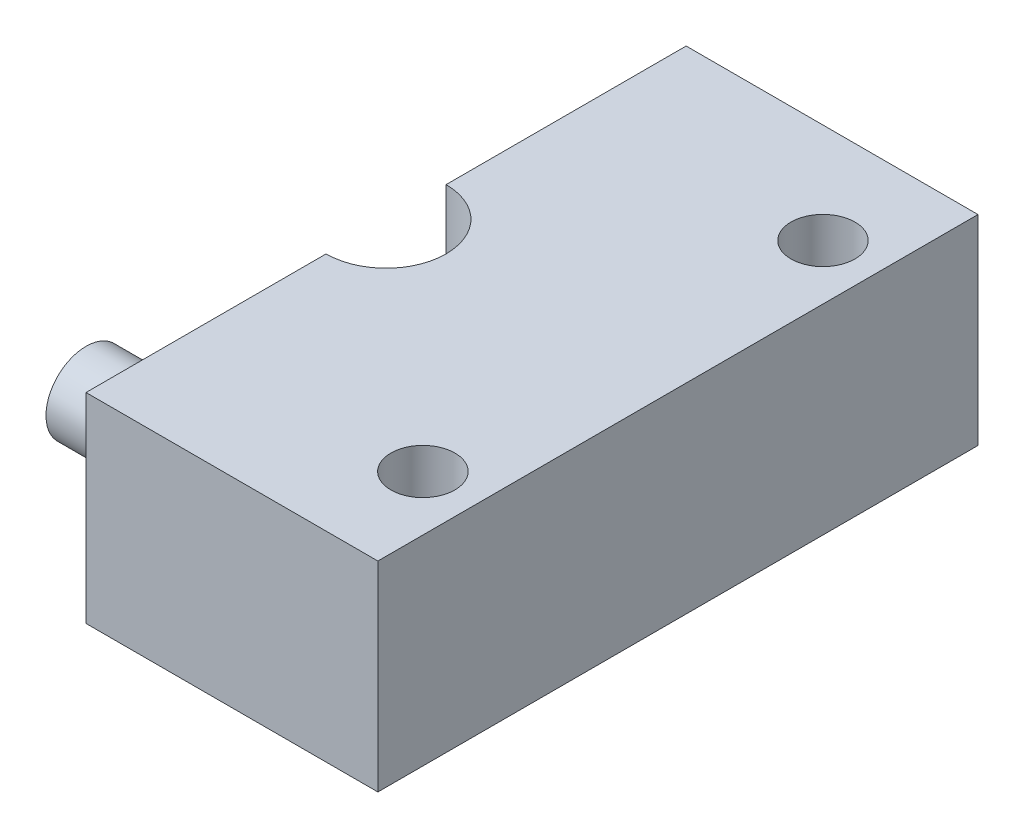
ISO-10303-21;
HEADER;
FILE_DESCRIPTION(('STEP AP214'),'2;1');
FILE_NAME('part.step','',(''),(''),'','','');
FILE_SCHEMA(('AUTOMOTIVE_DESIGN { 1 0 10303 214 1 1 1 1 }'));
ENDSEC;
DATA;
#1=APPLICATION_CONTEXT('core data for automotive mechanical design processes');
#2=APPLICATION_PROTOCOL_DEFINITION('international standard','automotive_design',2000,#1);
#3=PRODUCT_CONTEXT('',#1,'mechanical');
#4=PRODUCT('Part','Part','',(#3));
#5=PRODUCT_RELATED_PRODUCT_CATEGORY('part','',(#4));
#6=PRODUCT_DEFINITION_FORMATION('','',#4);
#7=PRODUCT_DEFINITION_CONTEXT('part definition',#1,'design');
#8=PRODUCT_DEFINITION('design','',#6,#7);
#9=PRODUCT_DEFINITION_SHAPE('','',#8);
#10=(LENGTH_UNIT() NAMED_UNIT(*) SI_UNIT(.MILLI.,.METRE.));
#11=(NAMED_UNIT(*) PLANE_ANGLE_UNIT() SI_UNIT($,.RADIAN.));
#12=(NAMED_UNIT(*) SI_UNIT($,.STERADIAN.) SOLID_ANGLE_UNIT());
#13=UNCERTAINTY_MEASURE_WITH_UNIT(LENGTH_MEASURE(1.E-05),#10,'distance_accuracy_value','');
#14=(GEOMETRIC_REPRESENTATION_CONTEXT(3) GLOBAL_UNCERTAINTY_ASSIGNED_CONTEXT((#13)) GLOBAL_UNIT_ASSIGNED_CONTEXT((#10,
#11,#12)) REPRESENTATION_CONTEXT('',''));
#15=CARTESIAN_POINT('',(0.,0.,0.));
#16=DIRECTION('',(0.,0.,1.));
#17=DIRECTION('',(1.,0.,0.));
#18=AXIS2_PLACEMENT_3D('',#15,#16,#17);
#19=CARTESIAN_POINT('',(0.,10.,30.));
#20=DIRECTION('',(1.,0.,0.));
#21=DIRECTION('',(0.,0.,-1.));
#22=AXIS2_PLACEMENT_3D('',#19,#20,#21);
#23=PLANE('',#22);
#24=CARTESIAN_POINT('',(0.,5.,25.));
#25=DIRECTION('',(1.,0.,0.));
#26=DIRECTION('',(0.,0.,-1.));
#27=AXIS2_PLACEMENT_3D('',#24,#25,#26);
#28=CIRCLE('',#27,3.);
#29=CARTESIAN_POINT('',(0.,5.,22.));
#30=VERTEX_POINT('',#29);
#31=EDGE_CURVE('E195',#30,#30,#28,.T.);
#32=ORIENTED_EDGE('',*,*,#31,.T.);
#33=EDGE_LOOP('',(#32));
#34=FACE_BOUND('',#33,.T.);
#35=DIRECTION('',(0.,0.,-1.));
#36=VECTOR('',#35,1.);
#37=CARTESIAN_POINT('',(0.,10.,30.));
#38=LINE('',#37,#36);
#39=CARTESIAN_POINT('',(0.,10.,30.));
#40=VERTEX_POINT('',#39);
#41=CARTESIAN_POINT('',(0.,10.,18.));
#42=VERTEX_POINT('',#41);
#43=EDGE_CURVE('E127',#40,#42,#38,.T.);
#44=ORIENTED_EDGE('',*,*,#43,.T.);
#45=DIRECTION('',(0.,1.,0.));
#46=VECTOR('',#45,1.);
#47=CARTESIAN_POINT('',(0.,-3.70820393249937,18.));
#48=LINE('',#47,#46);
#49=CARTESIAN_POINT('',(0.,3.,18.));
#50=VERTEX_POINT('',#49);
#51=EDGE_CURVE('E114',#50,#42,#48,.T.);
#52=ORIENTED_EDGE('',*,*,#51,.F.);
#53=DIRECTION('',(0.,0.,-1.));
#54=VECTOR('',#53,1.);
#55=CARTESIAN_POINT('',(0.,3.,21.));
#56=LINE('',#55,#54);
#57=CARTESIAN_POINT('',(0.,3.,21.));
#58=VERTEX_POINT('',#57);
#59=EDGE_CURVE('E124',#58,#50,#56,.T.);
#60=ORIENTED_EDGE('',*,*,#59,.F.);
#61=DIRECTION('',(0.,-1.,0.));
#62=VECTOR('',#61,1.);
#63=CARTESIAN_POINT('',(0.,3.,21.));
#64=LINE('',#63,#62);
#65=CARTESIAN_POINT('',(0.,0.,21.));
#66=VERTEX_POINT('',#65);
#67=EDGE_CURVE('E154',#58,#66,#64,.T.);
#68=ORIENTED_EDGE('',*,*,#67,.T.);
#69=DIRECTION('',(0.,0.,-1.));
#70=VECTOR('',#69,1.);
#71=CARTESIAN_POINT('',(0.,0.,30.));
#72=LINE('',#71,#70);
#73=CARTESIAN_POINT('',(0.,0.,30.));
#74=VERTEX_POINT('',#73);
#75=EDGE_CURVE('E189',#74,#66,#72,.T.);
#76=ORIENTED_EDGE('',*,*,#75,.F.);
#77=DIRECTION('',(0.,-1.,0.));
#78=VECTOR('',#77,1.);
#79=CARTESIAN_POINT('',(0.,10.,30.));
#80=LINE('',#79,#78);
#81=EDGE_CURVE('E162',#40,#74,#80,.T.);
#82=ORIENTED_EDGE('',*,*,#81,.F.);
#83=EDGE_LOOP('',(#44,#52,#60,#68,#76,#82));
#84=FACE_BOUND('',#83,.T.);
#85=ADVANCED_FACE('F35',(#34,#84),#23,.F.);
#86=CARTESIAN_POINT('',(0.,5.,5.));
#87=DIRECTION('',(1.,0.,0.));
#88=DIRECTION('',(0.,0.,-1.));
#89=AXIS2_PLACEMENT_3D('',#86,#87,#88);
#90=CIRCLE('',#89,3.075);
#91=CARTESIAN_POINT('',(0.,5.,1.925));
#92=VERTEX_POINT('',#91);
#93=EDGE_CURVE('E11',#92,#92,#90,.T.);
#94=ORIENTED_EDGE('',*,*,#93,.T.);
#95=EDGE_LOOP('',(#94));
#96=FACE_BOUND('',#95,.T.);
#97=CARTESIAN_POINT('',(0.,3.,12.));
#98=VERTEX_POINT('',#97);
#99=CARTESIAN_POINT('',(0.,3.,9.));
#100=VERTEX_POINT('',#99);
#101=EDGE_CURVE('E136',#98,#100,#56,.T.);
#102=ORIENTED_EDGE('',*,*,#101,.F.);
#103=DIRECTION('',(0.,1.,0.));
#104=VECTOR('',#103,1.);
#105=CARTESIAN_POINT('',(0.,-3.70820393249937,12.));
#106=LINE('',#105,#104);
#107=CARTESIAN_POINT('',(0.,10.,12.));
#108=VERTEX_POINT('',#107);
#109=EDGE_CURVE('E50',#98,#108,#106,.T.);
#110=ORIENTED_EDGE('',*,*,#109,.T.);
#111=CARTESIAN_POINT('',(0.,10.,0.));
#112=VERTEX_POINT('',#111);
#113=EDGE_CURVE('E172',#108,#112,#38,.T.);
#114=ORIENTED_EDGE('',*,*,#113,.T.);
#115=DIRECTION('',(0.,-1.,0.));
#116=VECTOR('',#115,1.);
#117=CARTESIAN_POINT('',(0.,10.,0.));
#118=LINE('',#117,#116);
#119=CARTESIAN_POINT('',(0.,0.,0.));
#120=VERTEX_POINT('',#119);
#121=EDGE_CURVE('E156',#112,#120,#118,.T.);
#122=ORIENTED_EDGE('',*,*,#121,.T.);
#123=CARTESIAN_POINT('',(0.,0.,9.));
#124=VERTEX_POINT('',#123);
#125=EDGE_CURVE('E188',#124,#120,#72,.T.);
#126=ORIENTED_EDGE('',*,*,#125,.F.);
#127=DIRECTION('',(0.,-1.,0.));
#128=VECTOR('',#127,1.);
#129=CARTESIAN_POINT('',(0.,3.,9.));
#130=LINE('',#129,#128);
#131=EDGE_CURVE('E58',#100,#124,#130,.T.);
#132=ORIENTED_EDGE('',*,*,#131,.F.);
#133=EDGE_LOOP('',(#102,#110,#114,#122,#126,#132));
#134=FACE_BOUND('',#133,.T.);
#135=ADVANCED_FACE('F213',(#96,#134),#23,.F.);
#136=CARTESIAN_POINT('',(0.,0.,30.));
#137=DIRECTION('',(0.,1.,0.));
#138=DIRECTION('',(0.,0.,1.));
#139=AXIS2_PLACEMENT_3D('',#136,#137,#138);
#140=PLANE('',#139);
#141=CARTESIAN_POINT('',(11.84,0.,25.));
#142=DIRECTION('',(0.,1.,0.));
#143=DIRECTION('',(0.,0.,1.));
#144=AXIS2_PLACEMENT_3D('',#141,#142,#143);
#145=CIRCLE('',#144,1.6);
#146=CARTESIAN_POINT('',(11.84,0.,26.6));
#147=VERTEX_POINT('',#146);
#148=EDGE_CURVE('E255',#147,#147,#145,.F.);
#149=ORIENTED_EDGE('',*,*,#148,.F.);
#150=EDGE_LOOP('',(#149));
#151=FACE_BOUND('',#150,.T.);
#152=CARTESIAN_POINT('',(11.84,0.,5.));
#153=DIRECTION('',(0.,1.,0.));
#154=DIRECTION('',(0.,0.,1.));
#155=AXIS2_PLACEMENT_3D('',#152,#153,#154);
#156=CIRCLE('',#155,1.6);
#157=CARTESIAN_POINT('',(11.84,0.,6.6));
#158=VERTEX_POINT('',#157);
#159=EDGE_CURVE('E143',#158,#158,#156,.F.);
#160=ORIENTED_EDGE('',*,*,#159,.F.);
#161=EDGE_LOOP('',(#160));
#162=FACE_BOUND('',#161,.T.);
#163=ORIENTED_EDGE('',*,*,#75,.T.);
#164=DIRECTION('',(-1.,0.,0.));
#165=VECTOR('',#164,1.);
#166=CARTESIAN_POINT('',(0.,0.,21.));
#167=LINE('',#166,#165);
#168=CARTESIAN_POINT('',(3.50749198145912,0.,21.));
#169=VERTEX_POINT('',#168);
#170=EDGE_CURVE('E141',#169,#66,#167,.T.);
#171=ORIENTED_EDGE('',*,*,#170,.F.);
#172=CARTESIAN_POINT('',(0.,0.,15.));
#173=DIRECTION('',(0.,-1.,0.));
#174=DIRECTION('',(0.,0.,-1.));
#175=AXIS2_PLACEMENT_3D('',#172,#173,#174);
#176=CIRCLE('',#175,6.95);
#177=CARTESIAN_POINT('',(3.50749198145913,0.,9.));
#178=VERTEX_POINT('',#177);
#179=EDGE_CURVE('E150',#178,#169,#176,.T.);
#180=ORIENTED_EDGE('',*,*,#179,.F.);
#181=DIRECTION('',(1.,0.,0.));
#182=VECTOR('',#181,1.);
#183=CARTESIAN_POINT('',(0.,0.,9.));
#184=LINE('',#183,#182);
#185=EDGE_CURVE('E148',#124,#178,#184,.T.);
#186=ORIENTED_EDGE('',*,*,#185,.F.);
#187=ORIENTED_EDGE('',*,*,#125,.T.);
#188=DIRECTION('',(1.,0.,0.));
#189=VECTOR('',#188,1.);
#190=CARTESIAN_POINT('',(0.,0.,0.));
#191=LINE('',#190,#189);
#192=CARTESIAN_POINT('',(14.59,0.,0.));
#193=VERTEX_POINT('',#192);
#194=EDGE_CURVE('E175',#120,#193,#191,.T.);
#195=ORIENTED_EDGE('',*,*,#194,.T.);
#196=DIRECTION('',(0.,0.,-1.));
#197=VECTOR('',#196,1.);
#198=CARTESIAN_POINT('',(14.59,0.,30.));
#199=LINE('',#198,#197);
#200=CARTESIAN_POINT('',(14.59,0.,30.));
#201=VERTEX_POINT('',#200);
#202=EDGE_CURVE('E185',#201,#193,#199,.T.);
#203=ORIENTED_EDGE('',*,*,#202,.F.);
#204=DIRECTION('',(1.,0.,0.));
#205=VECTOR('',#204,1.);
#206=CARTESIAN_POINT('',(0.,0.,30.));
#207=LINE('',#206,#205);
#208=EDGE_CURVE('E165',#74,#201,#207,.T.);
#209=ORIENTED_EDGE('',*,*,#208,.F.);
#210=EDGE_LOOP('',(#163,#171,#180,#186,#187,#195,#203,#209));
#211=FACE_BOUND('',#210,.T.);
#212=ADVANCED_FACE('F219',(#151,#162,#211),#140,.F.);
#213=CARTESIAN_POINT('',(14.59,0.,30.));
#214=DIRECTION('',(-1.,0.,0.));
#215=DIRECTION('',(0.,0.,1.));
#216=AXIS2_PLACEMENT_3D('',#213,#214,#215);
#217=PLANE('',#216);
#218=DIRECTION('',(0.,1.,0.));
#219=VECTOR('',#218,1.);
#220=CARTESIAN_POINT('',(14.59,0.,0.));
#221=LINE('',#220,#219);
#222=CARTESIAN_POINT('',(14.59,10.,0.));
#223=VERTEX_POINT('',#222);
#224=EDGE_CURVE('E177',#193,#223,#221,.T.);
#225=ORIENTED_EDGE('',*,*,#224,.T.);
#226=DIRECTION('',(0.,0.,-1.));
#227=VECTOR('',#226,1.);
#228=CARTESIAN_POINT('',(14.59,10.,30.));
#229=LINE('',#228,#227);
#230=CARTESIAN_POINT('',(14.59,10.,30.));
#231=VERTEX_POINT('',#230);
#232=EDGE_CURVE('E182',#231,#223,#229,.T.);
#233=ORIENTED_EDGE('',*,*,#232,.F.);
#234=DIRECTION('',(0.,1.,0.));
#235=VECTOR('',#234,1.);
#236=CARTESIAN_POINT('',(14.59,0.,30.));
#237=LINE('',#236,#235);
#238=EDGE_CURVE('E168',#201,#231,#237,.T.);
#239=ORIENTED_EDGE('',*,*,#238,.F.);
#240=ORIENTED_EDGE('',*,*,#202,.T.);
#241=EDGE_LOOP('',(#225,#233,#239,#240));
#242=FACE_BOUND('',#241,.T.);
#243=ADVANCED_FACE('F268',(#242),#217,.F.);
#244=CARTESIAN_POINT('',(14.59,10.,30.));
#245=DIRECTION('',(0.,-1.,0.));
#246=DIRECTION('',(0.,0.,-1.));
#247=AXIS2_PLACEMENT_3D('',#244,#245,#246);
#248=PLANE('',#247);
#249=CARTESIAN_POINT('',(11.84,10.,25.));
#250=DIRECTION('',(0.,1.,0.));
#251=DIRECTION('',(0.,0.,1.));
#252=AXIS2_PLACEMENT_3D('',#249,#250,#251);
#253=CIRCLE('',#252,1.6);
#254=CARTESIAN_POINT('',(11.84,10.,26.6));
#255=VERTEX_POINT('',#254);
#256=EDGE_CURVE('E252',#255,#255,#253,.T.);
#257=ORIENTED_EDGE('',*,*,#256,.F.);
#258=EDGE_LOOP('',(#257));
#259=FACE_BOUND('',#258,.T.);
#260=CARTESIAN_POINT('',(11.84,10.,5.));
#261=DIRECTION('',(0.,1.,0.));
#262=DIRECTION('',(0.,0.,1.));
#263=AXIS2_PLACEMENT_3D('',#260,#261,#262);
#264=CIRCLE('',#263,1.6);
#265=CARTESIAN_POINT('',(11.84,10.,6.6));
#266=VERTEX_POINT('',#265);
#267=EDGE_CURVE('E257',#266,#266,#264,.T.);
#268=ORIENTED_EDGE('',*,*,#267,.F.);
#269=EDGE_LOOP('',(#268));
#270=FACE_BOUND('',#269,.T.);
#271=ORIENTED_EDGE('',*,*,#113,.F.);
#272=CARTESIAN_POINT('',(0.,10.,15.));
#273=DIRECTION('',(0.,1.,0.));
#274=DIRECTION('',(0.,0.,1.));
#275=AXIS2_PLACEMENT_3D('',#272,#273,#274);
#276=CIRCLE('',#275,3.);
#277=EDGE_CURVE('E128',#42,#108,#276,.T.);
#278=ORIENTED_EDGE('',*,*,#277,.F.);
#279=ORIENTED_EDGE('',*,*,#43,.F.);
#280=DIRECTION('',(-1.,0.,0.));
#281=VECTOR('',#280,1.);
#282=CARTESIAN_POINT('',(14.59,10.,30.));
#283=LINE('',#282,#281);
#284=EDGE_CURVE('E170',#231,#40,#283,.T.);
#285=ORIENTED_EDGE('',*,*,#284,.F.);
#286=ORIENTED_EDGE('',*,*,#232,.T.);
#287=DIRECTION('',(-1.,0.,0.));
#288=VECTOR('',#287,1.);
#289=CARTESIAN_POINT('',(14.59,10.,0.));
#290=LINE('',#289,#288);
#291=EDGE_CURVE('E166',#223,#112,#290,.T.);
#292=ORIENTED_EDGE('',*,*,#291,.T.);
#293=EDGE_LOOP('',(#271,#278,#279,#285,#286,#292));
#294=FACE_BOUND('',#293,.T.);
#295=ADVANCED_FACE('F295',(#259,#270,#294),#248,.F.);
#296=CARTESIAN_POINT('',(0.,0.,30.));
#297=DIRECTION('',(0.,0.,1.));
#298=DIRECTION('',(1.,0.,0.));
#299=AXIS2_PLACEMENT_3D('',#296,#297,#298);
#300=PLANE('',#299);
#301=ORIENTED_EDGE('',*,*,#81,.T.);
#302=ORIENTED_EDGE('',*,*,#208,.T.);
#303=ORIENTED_EDGE('',*,*,#238,.T.);
#304=ORIENTED_EDGE('',*,*,#284,.T.);
#305=EDGE_LOOP('',(#301,#302,#303,#304));
#306=FACE_BOUND('',#305,.T.);
#307=ADVANCED_FACE('F293',(#306),#300,.T.);
#308=CARTESIAN_POINT('',(0.,0.,0.));
#309=DIRECTION('',(0.,0.,1.));
#310=DIRECTION('',(1.,0.,0.));
#311=AXIS2_PLACEMENT_3D('',#308,#309,#310);
#312=PLANE('',#311);
#313=ORIENTED_EDGE('',*,*,#121,.F.);
#314=ORIENTED_EDGE('',*,*,#291,.F.);
#315=ORIENTED_EDGE('',*,*,#224,.F.);
#316=ORIENTED_EDGE('',*,*,#194,.F.);
#317=EDGE_LOOP('',(#313,#314,#315,#316));
#318=FACE_BOUND('',#317,.T.);
#319=ADVANCED_FACE('F286',(#318),#312,.F.);
#320=CARTESIAN_POINT('',(0.,3.,21.));
#321=DIRECTION('',(0.,0.,1.));
#322=DIRECTION('',(1.,0.,0.));
#323=AXIS2_PLACEMENT_3D('',#320,#321,#322);
#324=PLANE('',#323);
#325=ORIENTED_EDGE('',*,*,#170,.T.);
#326=ORIENTED_EDGE('',*,*,#67,.F.);
#327=DIRECTION('',(-1.,0.,0.));
#328=VECTOR('',#327,1.);
#329=CARTESIAN_POINT('',(0.,3.,21.));
#330=LINE('',#329,#328);
#331=CARTESIAN_POINT('',(3.50749198145912,3.,21.));
#332=VERTEX_POINT('',#331);
#333=EDGE_CURVE('E134',#332,#58,#330,.T.);
#334=ORIENTED_EDGE('',*,*,#333,.F.);
#335=DIRECTION('',(0.,-1.,0.));
#336=VECTOR('',#335,1.);
#337=CARTESIAN_POINT('',(3.50749198145912,3.,21.));
#338=LINE('',#337,#336);
#339=EDGE_CURVE('E157',#332,#169,#338,.T.);
#340=ORIENTED_EDGE('',*,*,#339,.T.);
#341=EDGE_LOOP('',(#325,#326,#334,#340));
#342=FACE_BOUND('',#341,.T.);
#343=ADVANCED_FACE('F275',(#342),#324,.F.);
#344=CARTESIAN_POINT('',(0.,3.,15.));
#345=DIRECTION('',(0.,-1.,0.));
#346=DIRECTION('',(0.,0.,-1.));
#347=AXIS2_PLACEMENT_3D('',#344,#345,#346);
#348=CYLINDRICAL_SURFACE('',#347,6.95);
#349=ORIENTED_EDGE('',*,*,#179,.T.);
#350=ORIENTED_EDGE('',*,*,#339,.F.);
#351=CARTESIAN_POINT('',(0.,3.,15.));
#352=DIRECTION('',(0.,-1.,0.));
#353=DIRECTION('',(0.,0.,-1.));
#354=AXIS2_PLACEMENT_3D('',#351,#352,#353);
#355=CIRCLE('',#354,6.95);
#356=CARTESIAN_POINT('',(3.50749198145913,3.,9.));
#357=VERTEX_POINT('',#356);
#358=EDGE_CURVE('E139',#357,#332,#355,.T.);
#359=ORIENTED_EDGE('',*,*,#358,.F.);
#360=DIRECTION('',(0.,-1.,0.));
#361=VECTOR('',#360,1.);
#362=CARTESIAN_POINT('',(3.50749198145913,3.,9.));
#363=LINE('',#362,#361);
#364=EDGE_CURVE('E159',#357,#178,#363,.T.);
#365=ORIENTED_EDGE('',*,*,#364,.T.);
#366=EDGE_LOOP('',(#349,#350,#359,#365));
#367=FACE_BOUND('',#366,.T.);
#368=ADVANCED_FACE('F278',(#367),#348,.F.);
#369=CARTESIAN_POINT('',(0.,3.,9.));
#370=DIRECTION('',(0.,0.,-1.));
#371=DIRECTION('',(-1.,0.,0.));
#372=AXIS2_PLACEMENT_3D('',#369,#370,#371);
#373=PLANE('',#372);
#374=ORIENTED_EDGE('',*,*,#185,.T.);
#375=ORIENTED_EDGE('',*,*,#364,.F.);
#376=DIRECTION('',(1.,0.,0.));
#377=VECTOR('',#376,1.);
#378=CARTESIAN_POINT('',(0.,3.,9.));
#379=LINE('',#378,#377);
#380=EDGE_CURVE('E135',#100,#357,#379,.T.);
#381=ORIENTED_EDGE('',*,*,#380,.F.);
#382=ORIENTED_EDGE('',*,*,#131,.T.);
#383=EDGE_LOOP('',(#374,#375,#381,#382));
#384=FACE_BOUND('',#383,.T.);
#385=ADVANCED_FACE('F296',(#384),#373,.F.);
#386=CARTESIAN_POINT('',(0.,3.,15.));
#387=DIRECTION('',(0.,-1.,0.));
#388=DIRECTION('',(0.,0.,-1.));
#389=AXIS2_PLACEMENT_3D('',#386,#387,#388);
#390=PLANE('',#389);
#391=CARTESIAN_POINT('',(0.,3.,15.));
#392=DIRECTION('',(0.,-1.,0.));
#393=DIRECTION('',(0.,0.,-1.));
#394=AXIS2_PLACEMENT_3D('',#391,#392,#393);
#395=CIRCLE('',#394,3.);
#396=EDGE_CURVE('E111',#50,#98,#395,.F.);
#397=ORIENTED_EDGE('',*,*,#396,.T.);
#398=ORIENTED_EDGE('',*,*,#101,.T.);
#399=ORIENTED_EDGE('',*,*,#380,.T.);
#400=ORIENTED_EDGE('',*,*,#358,.T.);
#401=ORIENTED_EDGE('',*,*,#333,.T.);
#402=ORIENTED_EDGE('',*,*,#59,.T.);
#403=EDGE_LOOP('',(#397,#398,#399,#400,#401,#402));
#404=FACE_BOUND('',#403,.T.);
#405=ADVANCED_FACE('F131',(#404),#390,.T.);
#406=CARTESIAN_POINT('',(11.84,-4.52548339959391,5.));
#407=DIRECTION('',(0.,1.,0.));
#408=DIRECTION('',(0.,0.,1.));
#409=AXIS2_PLACEMENT_3D('',#406,#407,#408);
#410=CYLINDRICAL_SURFACE('',#409,1.6);
#411=ORIENTED_EDGE('',*,*,#159,.T.);
#412=EDGE_LOOP('',(#411));
#413=FACE_BOUND('',#412,.T.);
#414=ORIENTED_EDGE('',*,*,#267,.T.);
#415=EDGE_LOOP('',(#414));
#416=FACE_BOUND('',#415,.T.);
#417=ADVANCED_FACE('F264',(#413,#416),#410,.F.);
#418=CARTESIAN_POINT('',(11.84,-4.52548339959391,25.));
#419=DIRECTION('',(0.,1.,0.));
#420=DIRECTION('',(0.,0.,1.));
#421=AXIS2_PLACEMENT_3D('',#418,#419,#420);
#422=CYLINDRICAL_SURFACE('',#421,1.6);
#423=ORIENTED_EDGE('',*,*,#148,.T.);
#424=EDGE_LOOP('',(#423));
#425=FACE_BOUND('',#424,.T.);
#426=ORIENTED_EDGE('',*,*,#256,.T.);
#427=EDGE_LOOP('',(#426));
#428=FACE_BOUND('',#427,.T.);
#429=ADVANCED_FACE('F358',(#425,#428),#422,.F.);
#430=CARTESIAN_POINT('',(0.,-3.70820393249937,15.));
#431=DIRECTION('',(0.,1.,0.));
#432=DIRECTION('',(0.,0.,1.));
#433=AXIS2_PLACEMENT_3D('',#430,#431,#432);
#434=CYLINDRICAL_SURFACE('',#433,3.);
#435=ORIENTED_EDGE('',*,*,#51,.T.);
#436=ORIENTED_EDGE('',*,*,#277,.T.);
#437=ORIENTED_EDGE('',*,*,#109,.F.);
#438=ORIENTED_EDGE('',*,*,#396,.F.);
#439=EDGE_LOOP('',(#435,#436,#437,#438));
#440=FACE_BOUND('',#439,.T.);
#441=ADVANCED_FACE('F113',(#440),#434,.F.);
#442=CARTESIAN_POINT('',(-5.,5.,25.));
#443=DIRECTION('',(1.,0.,0.));
#444=DIRECTION('',(0.,0.,-1.));
#445=AXIS2_PLACEMENT_3D('',#442,#443,#444);
#446=CYLINDRICAL_SURFACE('',#445,2.);
#447=CARTESIAN_POINT('',(-1.,5.,25.));
#448=DIRECTION('',(1.,0.,0.));
#449=DIRECTION('',(0.,0.,-1.));
#450=AXIS2_PLACEMENT_3D('',#447,#448,#449);
#451=CIRCLE('',#450,2.);
#452=CARTESIAN_POINT('',(-1.,5.,23.));
#453=VERTEX_POINT('',#452);
#454=EDGE_CURVE('E192',#453,#453,#451,.F.);
#455=ORIENTED_EDGE('',*,*,#454,.T.);
#456=EDGE_LOOP('',(#455));
#457=FACE_BOUND('',#456,.T.);
#458=CARTESIAN_POINT('',(-5.,5.,25.));
#459=DIRECTION('',(-1.,0.,0.));
#460=DIRECTION('',(0.,0.,1.));
#461=AXIS2_PLACEMENT_3D('',#458,#459,#460);
#462=CIRCLE('',#461,2.);
#463=CARTESIAN_POINT('',(-5.,5.,27.));
#464=VERTEX_POINT('',#463);
#465=EDGE_CURVE('E244',#464,#464,#462,.T.);
#466=ORIENTED_EDGE('',*,*,#465,.F.);
#467=EDGE_LOOP('',(#466));
#468=FACE_BOUND('',#467,.T.);
#469=ADVANCED_FACE('F232',(#457,#468),#446,.T.);
#470=CARTESIAN_POINT('',(-5.,5.,25.));
#471=DIRECTION('',(-1.,0.,0.));
#472=DIRECTION('',(0.,0.,1.));
#473=AXIS2_PLACEMENT_3D('',#470,#471,#472);
#474=PLANE('',#473);
#475=ORIENTED_EDGE('',*,*,#465,.T.);
#476=EDGE_LOOP('',(#475));
#477=FACE_BOUND('',#476,.T.);
#478=ADVANCED_FACE('F225',(#477),#474,.T.);
#479=CARTESIAN_POINT('',(-1.,5.,25.));
#480=DIRECTION('',(1.,0.,0.));
#481=DIRECTION('',(0.,0.,-1.));
#482=AXIS2_PLACEMENT_3D('',#479,#480,#481);
#483=TOROIDAL_SURFACE('',#482,3.,1.);
#484=ORIENTED_EDGE('',*,*,#31,.F.);
#485=EDGE_LOOP('',(#484));
#486=FACE_BOUND('',#485,.T.);
#487=ORIENTED_EDGE('',*,*,#454,.F.);
#488=EDGE_LOOP('',(#487));
#489=FACE_BOUND('',#488,.T.);
#490=ADVANCED_FACE('F223',(#486,#489),#483,.F.);
#491=CARTESIAN_POINT('',(5.,5.,5.));
#492=DIRECTION('',(-1.,0.,0.));
#493=DIRECTION('',(0.,0.,1.));
#494=AXIS2_PLACEMENT_3D('',#491,#492,#493);
#495=CYLINDRICAL_SURFACE('',#494,2.075);
#496=CARTESIAN_POINT('',(1.,5.,5.));
#497=DIRECTION('',(1.,0.,0.));
#498=DIRECTION('',(0.,0.,-1.));
#499=AXIS2_PLACEMENT_3D('',#496,#497,#498);
#500=CIRCLE('',#499,2.075);
#501=CARTESIAN_POINT('',(1.,5.,2.925));
#502=VERTEX_POINT('',#501);
#503=EDGE_CURVE('E43',#502,#502,#500,.F.);
#504=ORIENTED_EDGE('',*,*,#503,.T.);
#505=EDGE_LOOP('',(#504));
#506=FACE_BOUND('',#505,.T.);
#507=CARTESIAN_POINT('',(5.,5.,5.));
#508=DIRECTION('',(-1.,0.,0.));
#509=DIRECTION('',(0.,0.,1.));
#510=AXIS2_PLACEMENT_3D('',#507,#508,#509);
#511=CIRCLE('',#510,2.075);
#512=CARTESIAN_POINT('',(5.,5.,7.075));
#513=VERTEX_POINT('',#512);
#514=EDGE_CURVE('E245',#513,#513,#511,.T.);
#515=ORIENTED_EDGE('',*,*,#514,.F.);
#516=EDGE_LOOP('',(#515));
#517=FACE_BOUND('',#516,.T.);
#518=ADVANCED_FACE('F200',(#506,#517),#495,.F.);
#519=CARTESIAN_POINT('',(5.,5.,5.));
#520=DIRECTION('',(-1.,0.,0.));
#521=DIRECTION('',(0.,0.,1.));
#522=AXIS2_PLACEMENT_3D('',#519,#520,#521);
#523=PLANE('',#522);
#524=ORIENTED_EDGE('',*,*,#514,.T.);
#525=EDGE_LOOP('',(#524));
#526=FACE_BOUND('',#525,.T.);
#527=ADVANCED_FACE('F204',(#526),#523,.T.);
#528=CARTESIAN_POINT('',(1.,5.,5.));
#529=DIRECTION('',(1.,0.,0.));
#530=DIRECTION('',(0.,0.,-1.));
#531=AXIS2_PLACEMENT_3D('',#528,#529,#530);
#532=TOROIDAL_SURFACE('',#531,3.075,1.);
#533=ORIENTED_EDGE('',*,*,#93,.F.);
#534=EDGE_LOOP('',(#533));
#535=FACE_BOUND('',#534,.T.);
#536=ORIENTED_EDGE('',*,*,#503,.F.);
#537=EDGE_LOOP('',(#536));
#538=FACE_BOUND('',#537,.T.);
#539=ADVANCED_FACE('F37',(#535,#538),#532,.T.);
#540=CLOSED_SHELL('',(#85,#135,#212,#243,#295,#307,#319,#343,#368,#385,#405,#417,#429,#441,#469,
#478,#490,#518,#527,#539));
#541=MANIFOLD_SOLID_BREP('B2',#540);
#542=ADVANCED_BREP_SHAPE_REPRESENTATION('',(#18,#541),#14);
#543=SHAPE_DEFINITION_REPRESENTATION(#9,#542);
ENDSEC;
END-ISO-10303-21;
